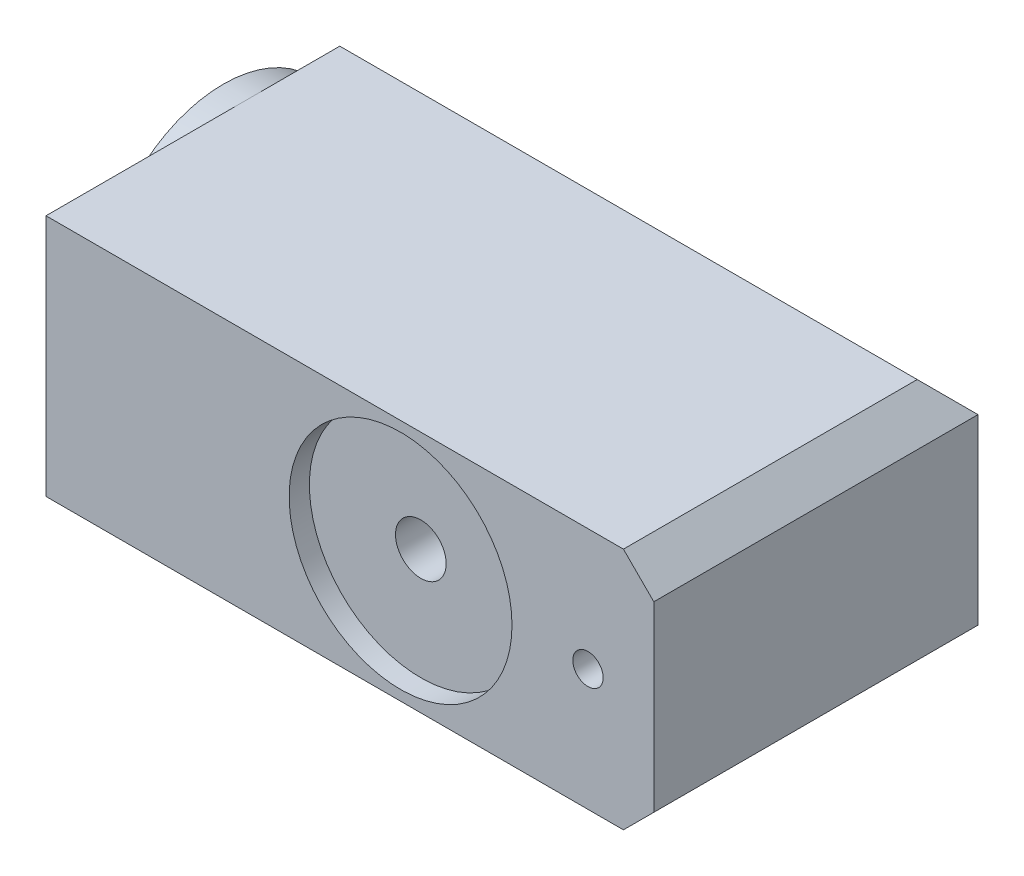
ISO-10303-21;
HEADER;
FILE_DESCRIPTION(('STEP AP214'),'2;1');
FILE_NAME('part.step','',(''),(''),'','','');
FILE_SCHEMA(('AUTOMOTIVE_DESIGN { 1 0 10303 214 1 1 1 1 }'));
ENDSEC;
DATA;
#1=APPLICATION_CONTEXT('core data for automotive mechanical design processes');
#2=APPLICATION_PROTOCOL_DEFINITION('international standard','automotive_design',2000,#1);
#3=PRODUCT_CONTEXT('',#1,'mechanical');
#4=PRODUCT('Part','Part','',(#3));
#5=PRODUCT_RELATED_PRODUCT_CATEGORY('part','',(#4));
#6=PRODUCT_DEFINITION_FORMATION('','',#4);
#7=PRODUCT_DEFINITION_CONTEXT('part definition',#1,'design');
#8=PRODUCT_DEFINITION('design','',#6,#7);
#9=PRODUCT_DEFINITION_SHAPE('','',#8);
#10=(LENGTH_UNIT() NAMED_UNIT(*) SI_UNIT(.MILLI.,.METRE.));
#11=(NAMED_UNIT(*) PLANE_ANGLE_UNIT() SI_UNIT($,.RADIAN.));
#12=(NAMED_UNIT(*) SI_UNIT($,.STERADIAN.) SOLID_ANGLE_UNIT());
#13=UNCERTAINTY_MEASURE_WITH_UNIT(LENGTH_MEASURE(1.E-05),#10,'distance_accuracy_value','');
#14=(GEOMETRIC_REPRESENTATION_CONTEXT(3) GLOBAL_UNCERTAINTY_ASSIGNED_CONTEXT((#13)) GLOBAL_UNIT_ASSIGNED_CONTEXT((#10,
#11,#12)) REPRESENTATION_CONTEXT('',''));
#15=CARTESIAN_POINT('',(0.,0.,0.));
#16=DIRECTION('',(0.,0.,1.));
#17=DIRECTION('',(1.,0.,0.));
#18=AXIS2_PLACEMENT_3D('',#15,#16,#17);
#19=CARTESIAN_POINT('',(-30.,12.,16.));
#20=DIRECTION('',(1.,0.,0.));
#21=DIRECTION('',(0.,1.,0.));
#22=AXIS2_PLACEMENT_3D('',#19,#20,#21);
#23=PLANE('',#22);
#24=DIRECTION('',(0.,0.,-1.));
#25=VECTOR('',#24,1.);
#26=CARTESIAN_POINT('',(-30.,12.,16.));
#27=LINE('',#26,#25);
#28=CARTESIAN_POINT('',(-30.,12.,-4.));
#29=VERTEX_POINT('',#28);
#30=CARTESIAN_POINT('',(-30.,12.,-13.));
#31=VERTEX_POINT('',#30);
#32=EDGE_CURVE('E218',#29,#31,#27,.T.);
#33=ORIENTED_EDGE('',*,*,#32,.T.);
#34=DIRECTION('',(0.,0.707106781186549,0.707106781186546));
#35=VECTOR('',#34,1.);
#36=CARTESIAN_POINT('',(-30.,12.,-13.));
#37=LINE('',#36,#35);
#38=CARTESIAN_POINT('',(-30.,8.99999999999998,-16.));
#39=VERTEX_POINT('',#38);
#40=EDGE_CURVE('E261',#31,#39,#37,.F.);
#41=ORIENTED_EDGE('',*,*,#40,.T.);
#42=DIRECTION('',(0.,-1.,0.));
#43=VECTOR('',#42,1.);
#44=CARTESIAN_POINT('',(-30.,12.,-16.));
#45=LINE('',#44,#43);
#46=CARTESIAN_POINT('',(-30.,0.,-16.));
#47=VERTEX_POINT('',#46);
#48=EDGE_CURVE('E197',#39,#47,#45,.T.);
#49=ORIENTED_EDGE('',*,*,#48,.T.);
#50=CARTESIAN_POINT('',(-30.,0.,-4.));
#51=DIRECTION('',(1.,0.,0.));
#52=DIRECTION('',(0.,1.,0.));
#53=AXIS2_PLACEMENT_3D('',#50,#51,#52);
#54=CIRCLE('',#53,12.);
#55=EDGE_CURVE('E182',#29,#47,#54,.F.);
#56=ORIENTED_EDGE('',*,*,#55,.F.);
#57=EDGE_LOOP('',(#33,#41,#49,#56));
#58=FACE_BOUND('',#57,.T.);
#59=ADVANCED_FACE('F51',(#58),#23,.F.);
#60=CARTESIAN_POINT('',(-30.,-8.99999999999998,-16.));
#61=VERTEX_POINT('',#60);
#62=EDGE_CURVE('E211',#47,#61,#45,.T.);
#63=ORIENTED_EDGE('',*,*,#62,.T.);
#64=DIRECTION('',(0.,0.707106781186549,-0.707106781186546));
#65=VECTOR('',#64,1.);
#66=CARTESIAN_POINT('',(-30.,-12.,-13.));
#67=LINE('',#66,#65);
#68=CARTESIAN_POINT('',(-30.,-12.,-13.));
#69=VERTEX_POINT('',#68);
#70=EDGE_CURVE('E254',#61,#69,#67,.F.);
#71=ORIENTED_EDGE('',*,*,#70,.T.);
#72=DIRECTION('',(0.,0.,-1.));
#73=VECTOR('',#72,1.);
#74=CARTESIAN_POINT('',(-30.,-12.,16.));
#75=LINE('',#74,#73);
#76=CARTESIAN_POINT('',(-30.,-12.,-4.));
#77=VERTEX_POINT('',#76);
#78=EDGE_CURVE('E207',#77,#69,#75,.T.);
#79=ORIENTED_EDGE('',*,*,#78,.F.);
#80=EDGE_CURVE('E177',#47,#77,#54,.F.);
#81=ORIENTED_EDGE('',*,*,#80,.F.);
#82=EDGE_LOOP('',(#63,#71,#79,#81));
#83=FACE_BOUND('',#82,.T.);
#84=ADVANCED_FACE('F290',(#83),#23,.F.);
#85=CARTESIAN_POINT('',(30.,12.,16.));
#86=DIRECTION('',(-1.,0.,0.));
#87=DIRECTION('',(0.,-1.,0.));
#88=AXIS2_PLACEMENT_3D('',#85,#86,#87);
#89=PLANE('',#88);
#90=DIRECTION('',(0.,1.,0.));
#91=VECTOR('',#90,1.);
#92=CARTESIAN_POINT('',(30.,12.,16.));
#93=LINE('',#92,#91);
#94=CARTESIAN_POINT('',(30.,-9.,16.));
#95=VERTEX_POINT('',#94);
#96=CARTESIAN_POINT('',(30.,8.99999999999998,16.));
#97=VERTEX_POINT('',#96);
#98=EDGE_CURVE('E192',#95,#97,#93,.T.);
#99=ORIENTED_EDGE('',*,*,#98,.F.);
#100=DIRECTION('',(0.,0.,-1.));
#101=VECTOR('',#100,1.);
#102=CARTESIAN_POINT('',(30.,-9.,16.));
#103=LINE('',#102,#101);
#104=CARTESIAN_POINT('',(30.,-9.,-16.));
#105=VERTEX_POINT('',#104);
#106=EDGE_CURVE('E225',#95,#105,#103,.T.);
#107=ORIENTED_EDGE('',*,*,#106,.T.);
#108=DIRECTION('',(0.,1.,0.));
#109=VECTOR('',#108,1.);
#110=CARTESIAN_POINT('',(30.,12.,-16.));
#111=LINE('',#110,#109);
#112=CARTESIAN_POINT('',(30.,8.99999999999998,-16.));
#113=VERTEX_POINT('',#112);
#114=EDGE_CURVE('E187',#105,#113,#111,.T.);
#115=ORIENTED_EDGE('',*,*,#114,.T.);
#116=DIRECTION('',(0.,0.,1.));
#117=VECTOR('',#116,1.);
#118=CARTESIAN_POINT('',(30.,8.99999999999998,16.));
#119=LINE('',#118,#117);
#120=EDGE_CURVE('E222',#113,#97,#119,.T.);
#121=ORIENTED_EDGE('',*,*,#120,.T.);
#122=EDGE_LOOP('',(#99,#107,#115,#121));
#123=FACE_BOUND('',#122,.T.);
#124=ADVANCED_FACE('F306',(#123),#89,.F.);
#125=CARTESIAN_POINT('',(-30.,12.,16.));
#126=DIRECTION('',(0.,-1.,0.));
#127=DIRECTION('',(0.,0.,-1.));
#128=AXIS2_PLACEMENT_3D('',#125,#126,#127);
#129=PLANE('',#128);
#130=DIRECTION('',(0.,0.,-1.));
#131=VECTOR('',#130,1.);
#132=CARTESIAN_POINT('',(27.,12.,16.));
#133=LINE('',#132,#131);
#134=CARTESIAN_POINT('',(27.,12.,16.));
#135=VERTEX_POINT('',#134);
#136=CARTESIAN_POINT('',(27.,12.,-13.));
#137=VERTEX_POINT('',#136);
#138=EDGE_CURVE('E238',#135,#137,#133,.T.);
#139=ORIENTED_EDGE('',*,*,#138,.T.);
#140=DIRECTION('',(-1.,0.,0.));
#141=VECTOR('',#140,1.);
#142=CARTESIAN_POINT('',(-30.,12.,-13.));
#143=LINE('',#142,#141);
#144=EDGE_CURVE('E257',#137,#31,#143,.T.);
#145=ORIENTED_EDGE('',*,*,#144,.T.);
#146=ORIENTED_EDGE('',*,*,#32,.F.);
#147=CARTESIAN_POINT('',(-30.,12.,16.));
#148=VERTEX_POINT('',#147);
#149=EDGE_CURVE('E219',#148,#29,#27,.T.);
#150=ORIENTED_EDGE('',*,*,#149,.F.);
#151=DIRECTION('',(-1.,0.,0.));
#152=VECTOR('',#151,1.);
#153=CARTESIAN_POINT('',(-30.,12.,16.));
#154=LINE('',#153,#152);
#155=EDGE_CURVE('E196',#135,#148,#154,.T.);
#156=ORIENTED_EDGE('',*,*,#155,.F.);
#157=EDGE_LOOP('',(#139,#145,#146,#150,#156));
#158=FACE_BOUND('',#157,.T.);
#159=ADVANCED_FACE('F333',(#158),#129,.F.);
#160=EDGE_CURVE('E181',#77,#29,#54,.F.);
#161=ORIENTED_EDGE('',*,*,#160,.F.);
#162=CARTESIAN_POINT('',(-30.,-12.,16.));
#163=VERTEX_POINT('',#162);
#164=EDGE_CURVE('E214',#163,#77,#75,.T.);
#165=ORIENTED_EDGE('',*,*,#164,.F.);
#166=DIRECTION('',(0.,-1.,0.));
#167=VECTOR('',#166,1.);
#168=CARTESIAN_POINT('',(-30.,12.,16.));
#169=LINE('',#168,#167);
#170=EDGE_CURVE('E200',#148,#163,#169,.T.);
#171=ORIENTED_EDGE('',*,*,#170,.F.);
#172=ORIENTED_EDGE('',*,*,#149,.T.);
#173=EDGE_LOOP('',(#161,#165,#171,#172));
#174=FACE_BOUND('',#173,.T.);
#175=ADVANCED_FACE('F284',(#174),#23,.F.);
#176=CARTESIAN_POINT('',(-30.,-12.,16.));
#177=DIRECTION('',(0.,1.,0.));
#178=DIRECTION('',(0.,0.,1.));
#179=AXIS2_PLACEMENT_3D('',#176,#177,#178);
#180=PLANE('',#179);
#181=ORIENTED_EDGE('',*,*,#78,.T.);
#182=DIRECTION('',(1.,0.,0.));
#183=VECTOR('',#182,1.);
#184=CARTESIAN_POINT('',(-30.,-12.,-13.));
#185=LINE('',#184,#183);
#186=CARTESIAN_POINT('',(27.,-12.,-13.));
#187=VERTEX_POINT('',#186);
#188=EDGE_CURVE('E241',#69,#187,#185,.T.);
#189=ORIENTED_EDGE('',*,*,#188,.T.);
#190=DIRECTION('',(0.,0.,1.));
#191=VECTOR('',#190,1.);
#192=CARTESIAN_POINT('',(27.,-12.,16.));
#193=LINE('',#192,#191);
#194=CARTESIAN_POINT('',(27.,-12.,16.));
#195=VERTEX_POINT('',#194);
#196=EDGE_CURVE('E229',#187,#195,#193,.T.);
#197=ORIENTED_EDGE('',*,*,#196,.T.);
#198=DIRECTION('',(1.,0.,0.));
#199=VECTOR('',#198,1.);
#200=CARTESIAN_POINT('',(-30.,-12.,16.));
#201=LINE('',#200,#199);
#202=EDGE_CURVE('E203',#163,#195,#201,.T.);
#203=ORIENTED_EDGE('',*,*,#202,.F.);
#204=ORIENTED_EDGE('',*,*,#164,.T.);
#205=EDGE_LOOP('',(#181,#189,#197,#203,#204));
#206=FACE_BOUND('',#205,.T.);
#207=ADVANCED_FACE('F295',(#206),#180,.F.);
#208=CARTESIAN_POINT('',(0.,0.,16.));
#209=DIRECTION('',(0.,0.,1.));
#210=DIRECTION('',(1.,0.,0.));
#211=AXIS2_PLACEMENT_3D('',#208,#209,#210);
#212=PLANE('',#211);
#213=CARTESIAN_POINT('',(23.5,0.,16.));
#214=DIRECTION('',(0.,0.,1.));
#215=DIRECTION('',(1.,0.,0.));
#216=AXIS2_PLACEMENT_3D('',#213,#214,#215);
#217=CIRCLE('',#216,1.5);
#218=CARTESIAN_POINT('',(25.,0.,16.));
#219=VERTEX_POINT('',#218);
#220=EDGE_CURVE('E151',#219,#219,#217,.T.);
#221=ORIENTED_EDGE('',*,*,#220,.F.);
#222=EDGE_LOOP('',(#221));
#223=FACE_BOUND('',#222,.T.);
#224=CARTESIAN_POINT('',(4.99999999999999,0.,16.));
#225=DIRECTION('',(0.,0.,1.));
#226=DIRECTION('',(1.,0.,0.));
#227=AXIS2_PLACEMENT_3D('',#224,#225,#226);
#228=CIRCLE('',#227,11.);
#229=CARTESIAN_POINT('',(16.,0.,16.));
#230=VERTEX_POINT('',#229);
#231=EDGE_CURVE('E188',#230,#230,#228,.T.);
#232=ORIENTED_EDGE('',*,*,#231,.F.);
#233=EDGE_LOOP('',(#232));
#234=FACE_BOUND('',#233,.T.);
#235=ORIENTED_EDGE('',*,*,#202,.T.);
#236=DIRECTION('',(-0.70710678118655,-0.707106781186545,0.));
#237=VECTOR('',#236,1.);
#238=CARTESIAN_POINT('',(19.4999999999999,-19.5,16.));
#239=LINE('',#238,#237);
#240=EDGE_CURVE('E235',#195,#95,#239,.F.);
#241=ORIENTED_EDGE('',*,*,#240,.T.);
#242=ORIENTED_EDGE('',*,*,#98,.T.);
#243=DIRECTION('',(0.707106781186546,-0.707106781186549,0.));
#244=VECTOR('',#243,1.);
#245=CARTESIAN_POINT('',(19.5000000000001,19.5,16.));
#246=LINE('',#245,#244);
#247=EDGE_CURVE('E232',#97,#135,#246,.F.);
#248=ORIENTED_EDGE('',*,*,#247,.T.);
#249=ORIENTED_EDGE('',*,*,#155,.T.);
#250=ORIENTED_EDGE('',*,*,#170,.T.);
#251=EDGE_LOOP('',(#235,#241,#242,#248,#249,#250));
#252=FACE_BOUND('',#251,.T.);
#253=ADVANCED_FACE('F299',(#223,#234,#252),#212,.T.);
#254=CARTESIAN_POINT('',(0.,0.,-16.));
#255=DIRECTION('',(0.,0.,1.));
#256=DIRECTION('',(1.,0.,0.));
#257=AXIS2_PLACEMENT_3D('',#254,#255,#256);
#258=PLANE('',#257);
#259=ORIENTED_EDGE('',*,*,#114,.F.);
#260=DIRECTION('',(-1.,0.,0.));
#261=VECTOR('',#260,1.);
#262=CARTESIAN_POINT('',(0.,-8.99999999999998,-16.));
#263=LINE('',#262,#261);
#264=EDGE_CURVE('E251',#105,#61,#263,.T.);
#265=ORIENTED_EDGE('',*,*,#264,.T.);
#266=ORIENTED_EDGE('',*,*,#62,.F.);
#267=ORIENTED_EDGE('',*,*,#48,.F.);
#268=DIRECTION('',(1.,0.,0.));
#269=VECTOR('',#268,1.);
#270=CARTESIAN_POINT('',(0.,8.99999999999998,-16.));
#271=LINE('',#270,#269);
#272=EDGE_CURVE('E248',#39,#113,#271,.T.);
#273=ORIENTED_EDGE('',*,*,#272,.T.);
#274=EDGE_LOOP('',(#259,#265,#266,#267,#273));
#275=FACE_BOUND('',#274,.T.);
#276=ADVANCED_FACE('F309',(#275),#258,.F.);
#277=CARTESIAN_POINT('',(30.,-9.,16.));
#278=DIRECTION('',(-0.707106781186545,0.70710678118655,0.));
#279=DIRECTION('',(0.,0.,-1.));
#280=AXIS2_PLACEMENT_3D('',#277,#278,#279);
#281=PLANE('',#280);
#282=ORIENTED_EDGE('',*,*,#196,.F.);
#283=DIRECTION('',(0.577350269189629,0.577350269189626,-0.577350269189623));
#284=VECTOR('',#283,1.);
#285=CARTESIAN_POINT('',(19.3333333333333,-19.6666666666666,-5.33333333333343));
#286=LINE('',#285,#284);
#287=EDGE_CURVE('E245',#187,#105,#286,.T.);
#288=ORIENTED_EDGE('',*,*,#287,.T.);
#289=ORIENTED_EDGE('',*,*,#106,.F.);
#290=ORIENTED_EDGE('',*,*,#240,.F.);
#291=EDGE_LOOP('',(#282,#288,#289,#290));
#292=FACE_BOUND('',#291,.T.);
#293=ADVANCED_FACE('F303',(#292),#281,.F.);
#294=CARTESIAN_POINT('',(27.,12.,16.));
#295=DIRECTION('',(-0.707106781186549,-0.707106781186546,0.));
#296=DIRECTION('',(0.,0.,-1.));
#297=AXIS2_PLACEMENT_3D('',#294,#295,#296);
#298=PLANE('',#297);
#299=ORIENTED_EDGE('',*,*,#120,.F.);
#300=DIRECTION('',(-0.577350269189625,0.577350269189628,0.577350269189625));
#301=VECTOR('',#300,1.);
#302=CARTESIAN_POINT('',(17.3333333333334,21.6666666666667,-3.33333333333336));
#303=LINE('',#302,#301);
#304=EDGE_CURVE('E81',#113,#137,#303,.T.);
#305=ORIENTED_EDGE('',*,*,#304,.T.);
#306=ORIENTED_EDGE('',*,*,#138,.F.);
#307=ORIENTED_EDGE('',*,*,#247,.F.);
#308=EDGE_LOOP('',(#299,#305,#306,#307));
#309=FACE_BOUND('',#308,.T.);
#310=ADVANCED_FACE('F349',(#309),#298,.F.);
#311=CARTESIAN_POINT('',(4.99999999999999,0.,14.));
#312=DIRECTION('',(0.,0.,1.));
#313=DIRECTION('',(1.,0.,0.));
#314=AXIS2_PLACEMENT_3D('',#311,#312,#313);
#315=CYLINDRICAL_SURFACE('',#314,11.);
#316=CARTESIAN_POINT('',(4.99999999999999,0.,14.));
#317=DIRECTION('',(0.,0.,1.));
#318=DIRECTION('',(1.,0.,0.));
#319=AXIS2_PLACEMENT_3D('',#316,#317,#318);
#320=CIRCLE('',#319,11.);
#321=CARTESIAN_POINT('',(16.,0.,14.));
#322=VERTEX_POINT('',#321);
#323=EDGE_CURVE('E183',#322,#322,#320,.T.);
#324=ORIENTED_EDGE('',*,*,#323,.F.);
#325=EDGE_LOOP('',(#324));
#326=FACE_BOUND('',#325,.T.);
#327=ORIENTED_EDGE('',*,*,#231,.T.);
#328=EDGE_LOOP('',(#327));
#329=FACE_BOUND('',#328,.T.);
#330=ADVANCED_FACE('F353',(#326,#329),#315,.F.);
#331=CARTESIAN_POINT('',(4.99999999999999,0.,14.));
#332=DIRECTION('',(0.,0.,1.));
#333=DIRECTION('',(1.,0.,0.));
#334=AXIS2_PLACEMENT_3D('',#331,#332,#333);
#335=PLANE('',#334);
#336=CARTESIAN_POINT('',(4.99999999999999,0.,14.));
#337=DIRECTION('',(0.,0.,1.));
#338=DIRECTION('',(1.,0.,0.));
#339=AXIS2_PLACEMENT_3D('',#336,#337,#338);
#340=CIRCLE('',#339,2.5);
#341=CARTESIAN_POINT('',(7.49999999999999,0.,14.));
#342=VERTEX_POINT('',#341);
#343=EDGE_CURVE('E569',#342,#342,#340,.T.);
#344=ORIENTED_EDGE('',*,*,#343,.F.);
#345=EDGE_LOOP('',(#344));
#346=FACE_BOUND('',#345,.T.);
#347=ORIENTED_EDGE('',*,*,#323,.T.);
#348=EDGE_LOOP('',(#347));
#349=FACE_BOUND('',#348,.T.);
#350=ADVANCED_FACE('F357',(#346,#349),#335,.T.);
#351=CARTESIAN_POINT('',(-32.5,0.,-4.));
#352=DIRECTION('',(1.,0.,0.));
#353=DIRECTION('',(0.,1.,0.));
#354=AXIS2_PLACEMENT_3D('',#351,#352,#353);
#355=CYLINDRICAL_SURFACE('',#354,9.5);
#356=CARTESIAN_POINT('',(7.49999999999999,0.,5.5));
#357=CARTESIAN_POINT('',(7.49999659165871,-0.137884663200167,5.4999978589319));
#358=CARTESIAN_POINT('',(7.48855441851343,-0.275806169982054,5.49696845553717));
#359=CARTESIAN_POINT('',(7.44316636127435,-0.547680422104071,5.48517762614523));
#360=CARTESIAN_POINT('',(7.40920923415977,-0.681631149673865,5.47641333641575));
#361=CARTESIAN_POINT('',(7.31996842460176,-0.941599795218325,5.45412076326044));
#362=CARTESIAN_POINT('',(7.26471183560934,-1.06762755548515,5.44059853395072));
#363=CARTESIAN_POINT('',(7.13453997893622,-1.30862652881559,5.41022151532826));
#364=CARTESIAN_POINT('',(7.0596235381961,-1.42359708156079,5.39336652717206));
#365=CARTESIAN_POINT('',(6.89046838430233,-1.64181993629425,5.35771941636593));
#366=CARTESIAN_POINT('',(6.79586767243448,-1.74478634632153,5.33889486727958));
#367=CARTESIAN_POINT('',(6.59080344133391,-1.93359084586557,5.30164002957558));
#368=CARTESIAN_POINT('',(6.48033793898573,-2.01942679084604,5.28320979057852));
#369=CARTESIAN_POINT('',(6.24441123162361,-2.17291708512181,5.24849966110085));
#370=CARTESIAN_POINT('',(6.11873074770613,-2.24024449868173,5.23226073792113));
#371=CARTESIAN_POINT('',(5.8573378957766,-2.35270147526437,5.20424780640168));
#372=CARTESIAN_POINT('',(5.72162732895978,-2.39783501276008,5.19247299871599));
#373=CARTESIAN_POINT('',(5.44718807189353,-2.46363395134783,5.17505594709916));
#374=CARTESIAN_POINT('',(5.30859185215417,-2.48481677617339,5.16928424369479));
#375=CARTESIAN_POINT('',(5.02970199432701,-2.50372582423423,5.16413995150101));
#376=CARTESIAN_POINT('',(4.88940866907858,-2.50145630672462,5.16476620075867));
#377=CARTESIAN_POINT('',(4.6151297705527,-2.47393631594874,5.1722310773399));
#378=CARTESIAN_POINT('',(4.48107626626276,-2.44930986906015,5.1789010040012));
#379=CARTESIAN_POINT('',(4.21907399632413,-2.37877367007175,5.19743185586801));
#380=CARTESIAN_POINT('',(4.09112570806025,-2.33286225663581,5.20929318626939));
#381=CARTESIAN_POINT('',(3.84332921291467,-2.22054589835919,5.23702010881477));
#382=CARTESIAN_POINT('',(3.72358589593431,-2.15392053169779,5.25292841794966));
#383=CARTESIAN_POINT('',(3.49675864085507,-2.0022213702002,5.28693362281546));
#384=CARTESIAN_POINT('',(3.38967714180209,-1.91714402987704,5.30503093886097));
#385=CARTESIAN_POINT('',(3.18764550754465,-1.72775627146102,5.3420790135668));
#386=CARTESIAN_POINT('',(3.09318807802019,-1.62292126601543,5.36103863220119));
#387=CARTESIAN_POINT('',(2.92309534560223,-1.39866809045069,5.39715951587145));
#388=CARTESIAN_POINT('',(2.84746074662742,-1.27924937519245,5.41432071363776));
#389=CARTESIAN_POINT('',(2.71695157003836,-1.02846858783735,5.44501219877018));
#390=CARTESIAN_POINT('',(2.66216418316355,-0.897059143717848,5.45852716922197));
#391=CARTESIAN_POINT('',(2.57559958620402,-0.626458525351712,5.48029259145042));
#392=CARTESIAN_POINT('',(2.54381748368608,-0.487269012444904,5.48854416252684));
#393=CARTESIAN_POINT('',(2.5049346793655,-0.209265832527545,5.49868456798611));
#394=CARTESIAN_POINT('',(2.49716387299718,-0.0705520479839298,5.50074610556024));
#395=CARTESIAN_POINT('',(2.50467639612566,0.206196087317413,5.49876969604928));
#396=CARTESIAN_POINT('',(2.51995740962853,0.344230504932652,5.49473236171185));
#397=CARTESIAN_POINT('',(2.57258954561613,0.613323515414332,5.48112321375656));
#398=CARTESIAN_POINT('',(2.60956867003488,0.744460020527066,5.47164474240174));
#399=CARTESIAN_POINT('',(2.70411687054361,0.998656954500423,5.44822690666909));
#400=CARTESIAN_POINT('',(2.76168814737889,1.12171651848974,5.43428706550801));
#401=CARTESIAN_POINT('',(2.89704132213315,1.35888360619122,5.40308612567744));
#402=CARTESIAN_POINT('',(2.97519008957206,1.47277384906795,5.38576639011377));
#403=CARTESIAN_POINT('',(3.14901703039048,1.68605972580164,5.34980860657983));
#404=CARTESIAN_POINT('',(3.24469857228237,1.78545256772039,5.33117030570127));
#405=CARTESIAN_POINT('',(3.4539990107019,1.96973268881778,5.29404354754289));
#406=CARTESIAN_POINT('',(3.56803766334183,2.05414772804201,5.27557319869389));
#407=CARTESIAN_POINT('',(3.80905049612895,2.20265077284399,5.24143699546797));
#408=CARTESIAN_POINT('',(3.93602412599753,2.26673964265903,5.2257710218657));
#409=CARTESIAN_POINT('',(4.19865623456443,2.37228864024204,5.1991961819113));
#410=CARTESIAN_POINT('',(4.33425868115595,2.41388084425638,5.18825962723044));
#411=CARTESIAN_POINT('',(4.61086822724661,2.47357685539613,5.17237100532096));
#412=CARTESIAN_POINT('',(4.75187398049022,2.49168647462762,5.16741745727661));
#413=CARTESIAN_POINT('',(5.03045917771289,2.5035754058712,5.16417710271858));
#414=CARTESIAN_POINT('',(5.16800434532391,2.49811278703346,5.16568256903698));
#415=CARTESIAN_POINT('',(5.44013800418689,2.46476570057896,5.17470557273123));
#416=CARTESIAN_POINT('',(5.57472656770531,2.43688178162009,5.18222296299294));
#417=CARTESIAN_POINT('',(5.83620045149247,2.35991776153104,5.20230081361892));
#418=CARTESIAN_POINT('',(5.9631349510855,2.31099432245761,5.21482395306799));
#419=CARTESIAN_POINT('',(6.20708916373461,2.19346205912632,5.2435040513402));
#420=CARTESIAN_POINT('',(6.32410735557114,2.12485022160876,5.25966156631347));
#421=CARTESIAN_POINT('',(6.5485354125825,1.96757430903026,5.29436941418334));
#422=CARTESIAN_POINT('',(6.65557291757329,1.87839103794925,5.31297513141964));
#423=CARTESIAN_POINT('',(6.85340941336071,1.68349652387403,5.35016921749174));
#424=CARTESIAN_POINT('',(6.94420447161772,1.57778128982408,5.36875758104519));
#425=CARTESIAN_POINT('',(7.10882024635571,1.35018708630134,5.40428175818212));
#426=CARTESIAN_POINT('',(7.18225135974022,1.22801920680847,5.42117547738053));
#427=CARTESIAN_POINT('',(7.30741745059362,0.972633879166114,5.45095016006557));
#428=CARTESIAN_POINT('',(7.35916670410621,0.839423771021185,5.46383376250233));
#429=CARTESIAN_POINT('',(7.43254809015212,0.588875796526845,5.48241870918101));
#430=CARTESIAN_POINT('',(7.4577847005347,0.472643351989966,5.4889642500444));
#431=CARTESIAN_POINT('',(7.49151134277624,0.237616231690475,5.49775561739774));
#432=CARTESIAN_POINT('',(7.50000293713037,0.118821796035813,5.50000184506058));
#433=CARTESIAN_POINT('',(7.49999999999999,0.,5.5));
#434=B_SPLINE_CURVE_WITH_KNOTS('',3,(#356,#357,#358,#359,#360,#361,#362,#363,#364,#365,#366,
#367,#368,#369,#370,#371,#372,#373,#374,#375,#376,#377,#378,#379,#380,#381,#382,#383,#384,#385,
#386,#387,#388,#389,#390,#391,#392,#393,#394,#395,#396,#397,#398,#399,#400,#401,#402,#403,#404,
#405,#406,#407,#408,#409,#410,#411,#412,#413,#414,#415,#416,#417,#418,#419,#420,#421,#422,#423,
#424,#425,#426,#427,#428,#429,#430,#431,#432,#433),.UNSPECIFIED.,.T.,.F.,(4,2,2,2,2,2,2,2,2,2,2,
2,2,2,2,2,2,2,2,2,2,2,2,2,2,2,2,2,2,2,2,2,2,2,2,2,2,2,4),(0.,0.413218307292529,
0.826643113984269,1.23954376015726,1.65246904879306,2.07379267437497,2.49516901176602,
2.92356960617624,3.35189345476611,3.77077570910304,4.18958189022737,4.59704611478664,
5.00454214813608,5.41653210536598,5.82860129537586,6.2537447574079,6.67890411617068,
7.10582259900531,7.53265026425716,7.94745325887929,8.36221458142332,8.7700647180204,
9.177958455819,9.59368485631318,10.0094912128133,10.4366941512347,10.8638789232118,
11.2885277256592,11.7130714044454,12.1240655288083,12.5350495962919,12.9430250337226,
13.3510629440972,13.7708169031548,14.1906723537905,14.6192052314105,15.0474555038948,
15.4035786755636,15.7596686154295),.UNSPECIFIED.);
#435=CARTESIAN_POINT('',(7.49999999999999,0.,5.5));
#436=VERTEX_POINT('',#435);
#437=EDGE_CURVE('E56',#436,#436,#434,.T.);
#438=ORIENTED_EDGE('',*,*,#437,.F.);
#439=EDGE_LOOP('',(#438));
#440=FACE_BOUND('',#439,.T.);
#441=CARTESIAN_POINT('',(23.,-1.4142135623731,5.39414711402797));
#442=CARTESIAN_POINT('',(22.960137340061,-1.40011970673381,5.39626758077751));
#443=CARTESIAN_POINT('',(22.9209013003721,-1.3843507187182,5.3986103359582));
#444=CARTESIAN_POINT('',(22.8439219717549,-1.34957291784789,5.40366775876576));
#445=CARTESIAN_POINT('',(22.8061785308876,-1.33056443580877,5.40638238841143));
#446=CARTESIAN_POINT('',(22.6956585352951,-1.26890986384077,5.41496619010077));
#447=CARTESIAN_POINT('',(22.6254564132959,-1.22158640772961,5.42128290951123));
#448=CARTESIAN_POINT('',(22.4940375072463,-1.1158688090482,5.43438740754582));
#449=CARTESIAN_POINT('',(22.4328228811174,-1.05747201542778,5.44117529872524));
#450=CARTESIAN_POINT('',(22.3210432752386,-0.93121668761424,5.45446222153537));
#451=CARTESIAN_POINT('',(22.270477019683,-0.863359288538879,5.46096128769718));
#452=CARTESIAN_POINT('',(22.1812895948509,-0.719835798307583,5.47296311582789));
#453=CARTESIAN_POINT('',(22.142704752577,-0.644146869647482,5.47846282729498));
#454=CARTESIAN_POINT('',(22.0788169734486,-0.487249825109341,5.48782150882409));
#455=CARTESIAN_POINT('',(22.0535148826397,-0.406041358035962,5.49168037436934));
#456=CARTESIAN_POINT('',(22.0171287920342,-0.241161892391548,5.49729349229693));
#457=CARTESIAN_POINT('',(22.0059243889218,-0.157518077510846,5.49906555881411));
#458=CARTESIAN_POINT('',(21.9976813646977,0.0104754969992231,5.50036544529815));
#459=CARTESIAN_POINT('',(22.0006412258737,0.0948251800274315,5.49989350571214));
#460=CARTESIAN_POINT('',(22.0205442831485,0.261074716115656,5.49677293127934));
#461=CARTESIAN_POINT('',(22.0373668621601,0.342989409274484,5.4941430729441));
#462=CARTESIAN_POINT('',(22.0843329626379,0.502816775045947,5.48702158836897));
#463=CARTESIAN_POINT('',(22.1144764075154,0.580729470665299,5.48252997283332));
#464=CARTESIAN_POINT('',(22.1873654413868,0.730736401333963,5.47215434081591));
#465=CARTESIAN_POINT('',(22.230165555,0.802803706598277,5.46626432214905));
#466=CARTESIAN_POINT('',(22.3271322317792,0.938806438536284,5.4537460929921));
#467=CARTESIAN_POINT('',(22.3813032870549,1.00273863534138,5.44711759125009));
#468=CARTESIAN_POINT('',(22.5001821199504,1.12138399514821,5.43377496415155));
#469=CARTESIAN_POINT('',(22.5650036117844,1.17598302232853,5.42706072863519));
#470=CARTESIAN_POINT('',(22.702903341002,1.27347686380495,5.41438683519921));
#471=CARTESIAN_POINT('',(22.77596836085,1.31639004816268,5.40842600093675));
#472=CARTESIAN_POINT('',(22.8761599122898,1.36438338605162,5.40152072453957));
#473=CARTESIAN_POINT('',(22.9005682404225,1.37528104906079,5.39993134003404));
#474=CARTESIAN_POINT('',(22.9499010853996,1.39574389449479,5.3969146924482));
#475=CARTESIAN_POINT('',(22.9748247138413,1.40531118102459,5.3954871740383));
#476=CARTESIAN_POINT('',(23.,1.4142135623731,5.39414711402797));
#477=B_SPLINE_CURVE_WITH_KNOTS('',3,(#441,#442,#443,#444,#445,#446,#447,#448,#449,#450,#451,
#452,#453,#454,#455,#456,#457,#458,#459,#460,#461,#462,#463,#464,#465,#466,#467,#468,#469,#470,
#471,#472,#473,#474,#475,#476),.UNSPECIFIED.,.F.,.F.,(4,2,2,2,2,2,2,2,2,2,2,2,2,2,2,2,2,4),(0.,
0.126921965744115,0.253830978035678,0.507221339028463,0.760672440572525,1.01409315826285,
1.26827489633055,1.5224728225564,1.7744846636609,2.02646950209578,2.2762847303728,
2.52609852234917,2.77700458563296,3.02800995695931,3.28189394943519,3.5353765034408,
3.61568266282445,3.69586033024587),.UNSPECIFIED.);
#478=CARTESIAN_POINT('',(23.,-1.4142135623731,5.39414711402797));
#479=VERTEX_POINT('',#478);
#480=CARTESIAN_POINT('',(23.,1.4142135623731,5.39414711402797));
#481=VERTEX_POINT('',#480);
#482=EDGE_CURVE('E150',#479,#481,#477,.T.);
#483=ORIENTED_EDGE('',*,*,#482,.F.);
#484=CARTESIAN_POINT('',(23.,0.,-4.));
#485=DIRECTION('',(-1.,0.,0.));
#486=DIRECTION('',(0.,-1.,0.));
#487=AXIS2_PLACEMENT_3D('',#484,#485,#486);
#488=CIRCLE('',#487,9.5);
#489=EDGE_CURVE('E156',#479,#481,#488,.F.);
#490=ORIENTED_EDGE('',*,*,#489,.T.);
#491=EDGE_LOOP('',(#483,#490));
#492=FACE_BOUND('',#491,.T.);
#493=CARTESIAN_POINT('',(-32.5,0.,-4.));
#494=DIRECTION('',(-1.,0.,0.));
#495=DIRECTION('',(0.,-1.,0.));
#496=AXIS2_PLACEMENT_3D('',#493,#494,#495);
#497=CIRCLE('',#496,9.5);
#498=CARTESIAN_POINT('',(-32.5,-9.50000000000001,-4.));
#499=VERTEX_POINT('',#498);
#500=EDGE_CURVE('E159',#499,#499,#497,.T.);
#501=ORIENTED_EDGE('',*,*,#500,.T.);
#502=EDGE_LOOP('',(#501));
#503=FACE_BOUND('',#502,.T.);
#504=ADVANCED_FACE('F366',(#440,#492,#503),#355,.F.);
#505=CARTESIAN_POINT('',(-32.5,0.,-4.));
#506=DIRECTION('',(1.,0.,0.));
#507=DIRECTION('',(0.,1.,0.));
#508=AXIS2_PLACEMENT_3D('',#505,#506,#507);
#509=CYLINDRICAL_SURFACE('',#508,12.);
#510=CARTESIAN_POINT('',(-32.5,0.,-4.));
#511=DIRECTION('',(-1.,0.,0.));
#512=DIRECTION('',(0.,-1.,0.));
#513=AXIS2_PLACEMENT_3D('',#510,#511,#512);
#514=CIRCLE('',#513,12.);
#515=CARTESIAN_POINT('',(-32.5,-12.,-4.));
#516=VERTEX_POINT('',#515);
#517=EDGE_CURVE('E164',#516,#516,#514,.T.);
#518=ORIENTED_EDGE('',*,*,#517,.F.);
#519=EDGE_LOOP('',(#518));
#520=FACE_BOUND('',#519,.T.);
#521=ORIENTED_EDGE('',*,*,#160,.T.);
#522=ORIENTED_EDGE('',*,*,#55,.T.);
#523=ORIENTED_EDGE('',*,*,#80,.T.);
#524=EDGE_LOOP('',(#521,#522,#523));
#525=FACE_BOUND('',#524,.T.);
#526=ADVANCED_FACE('F278',(#520,#525),#509,.T.);
#527=CARTESIAN_POINT('',(-32.5,0.,-4.));
#528=DIRECTION('',(-1.,0.,0.));
#529=DIRECTION('',(0.,-1.,0.));
#530=AXIS2_PLACEMENT_3D('',#527,#528,#529);
#531=PLANE('',#530);
#532=ORIENTED_EDGE('',*,*,#517,.T.);
#533=EDGE_LOOP('',(#532));
#534=FACE_BOUND('',#533,.T.);
#535=ORIENTED_EDGE('',*,*,#500,.F.);
#536=EDGE_LOOP('',(#535));
#537=FACE_BOUND('',#536,.T.);
#538=ADVANCED_FACE('F320',(#534,#537),#531,.T.);
#539=CARTESIAN_POINT('',(23.,12.,16.));
#540=DIRECTION('',(-1.,0.,0.));
#541=DIRECTION('',(0.,-1.,0.));
#542=AXIS2_PLACEMENT_3D('',#539,#540,#541);
#543=PLANE('',#542);
#544=DIRECTION('',(0.,0.,1.));
#545=VECTOR('',#544,1.);
#546=CARTESIAN_POINT('',(23.,-1.4142135623731,4.));
#547=LINE('',#546,#545);
#548=CARTESIAN_POINT('',(23.,-1.4142135623731,4.));
#549=VERTEX_POINT('',#548);
#550=EDGE_CURVE('E12',#549,#479,#547,.T.);
#551=ORIENTED_EDGE('',*,*,#550,.F.);
#552=DIRECTION('',(0.,1.,0.));
#553=VECTOR('',#552,1.);
#554=CARTESIAN_POINT('',(23.,12.,4.));
#555=LINE('',#554,#553);
#556=CARTESIAN_POINT('',(23.,1.4142135623731,4.));
#557=VERTEX_POINT('',#556);
#558=EDGE_CURVE('E138',#549,#557,#555,.T.);
#559=ORIENTED_EDGE('',*,*,#558,.T.);
#560=DIRECTION('',(0.,0.,1.));
#561=VECTOR('',#560,1.);
#562=CARTESIAN_POINT('',(23.,1.4142135623731,4.));
#563=LINE('',#562,#561);
#564=EDGE_CURVE('E67',#481,#557,#563,.F.);
#565=ORIENTED_EDGE('',*,*,#564,.F.);
#566=ORIENTED_EDGE('',*,*,#489,.F.);
#567=EDGE_LOOP('',(#551,#559,#565,#566));
#568=FACE_BOUND('',#567,.T.);
#569=ADVANCED_FACE('F154',(#568),#543,.T.);
#570=CARTESIAN_POINT('',(-30.,-12.,-13.));
#571=DIRECTION('',(0.,0.707106781186546,0.707106781186549));
#572=DIRECTION('',(1.,0.,0.));
#573=AXIS2_PLACEMENT_3D('',#570,#571,#572);
#574=PLANE('',#573);
#575=ORIENTED_EDGE('',*,*,#70,.F.);
#576=ORIENTED_EDGE('',*,*,#264,.F.);
#577=ORIENTED_EDGE('',*,*,#287,.F.);
#578=ORIENTED_EDGE('',*,*,#188,.F.);
#579=EDGE_LOOP('',(#575,#576,#577,#578));
#580=FACE_BOUND('',#579,.T.);
#581=ADVANCED_FACE('F313',(#580),#574,.F.);
#582=CARTESIAN_POINT('',(-30.,12.,-13.));
#583=DIRECTION('',(0.,-0.707106781186546,0.707106781186549));
#584=DIRECTION('',(-1.,0.,0.));
#585=AXIS2_PLACEMENT_3D('',#582,#583,#584);
#586=PLANE('',#585);
#587=ORIENTED_EDGE('',*,*,#304,.F.);
#588=ORIENTED_EDGE('',*,*,#272,.F.);
#589=ORIENTED_EDGE('',*,*,#40,.F.);
#590=ORIENTED_EDGE('',*,*,#144,.F.);
#591=EDGE_LOOP('',(#587,#588,#589,#590));
#592=FACE_BOUND('',#591,.T.);
#593=ADVANCED_FACE('F54',(#592),#586,.F.);
#594=CARTESIAN_POINT('',(23.5,0.,4.));
#595=DIRECTION('',(0.,0.,1.));
#596=DIRECTION('',(1.,0.,0.));
#597=AXIS2_PLACEMENT_3D('',#594,#595,#596);
#598=CYLINDRICAL_SURFACE('',#597,1.5);
#599=ORIENTED_EDGE('',*,*,#550,.T.);
#600=ORIENTED_EDGE('',*,*,#482,.T.);
#601=ORIENTED_EDGE('',*,*,#564,.T.);
#602=CARTESIAN_POINT('',(23.5,0.,4.));
#603=DIRECTION('',(0.,0.,1.));
#604=DIRECTION('',(1.,0.,0.));
#605=AXIS2_PLACEMENT_3D('',#602,#603,#604);
#606=CIRCLE('',#605,1.5);
#607=EDGE_CURVE('E73',#549,#557,#606,.T.);
#608=ORIENTED_EDGE('',*,*,#607,.F.);
#609=EDGE_LOOP('',(#599,#600,#601,#608));
#610=FACE_BOUND('',#609,.T.);
#611=ORIENTED_EDGE('',*,*,#220,.T.);
#612=EDGE_LOOP('',(#611));
#613=FACE_BOUND('',#612,.T.);
#614=ADVANCED_FACE('F146',(#610,#613),#598,.F.);
#615=CARTESIAN_POINT('',(23.5,0.,4.));
#616=DIRECTION('',(0.,0.,1.));
#617=DIRECTION('',(1.,0.,0.));
#618=AXIS2_PLACEMENT_3D('',#615,#616,#617);
#619=PLANE('',#618);
#620=ORIENTED_EDGE('',*,*,#607,.T.);
#621=ORIENTED_EDGE('',*,*,#558,.F.);
#622=EDGE_LOOP('',(#620,#621));
#623=FACE_BOUND('',#622,.T.);
#624=ADVANCED_FACE('F139',(#623),#619,.T.);
#625=CARTESIAN_POINT('',(4.99999999999999,0.,14.));
#626=DIRECTION('',(0.,0.,1.));
#627=DIRECTION('',(1.,0.,0.));
#628=AXIS2_PLACEMENT_3D('',#625,#626,#627);
#629=CYLINDRICAL_SURFACE('',#628,2.5);
#630=ORIENTED_EDGE('',*,*,#437,.T.);
#631=EDGE_LOOP('',(#630));
#632=FACE_BOUND('',#631,.T.);
#633=ORIENTED_EDGE('',*,*,#343,.T.);
#634=EDGE_LOOP('',(#633));
#635=FACE_BOUND('',#634,.T.);
#636=ADVANCED_FACE('F437',(#632,#635),#629,.F.);
#637=CLOSED_SHELL('',(#59,#84,#124,#159,#175,#207,#253,#276,#293,#310,#330,#350,#504,#526,#538,
#569,#581,#593,#614,#624,#636));
#638=MANIFOLD_SOLID_BREP('B2',#637);
#639=ADVANCED_BREP_SHAPE_REPRESENTATION('',(#18,#638),#14);
#640=SHAPE_DEFINITION_REPRESENTATION(#9,#639);
ENDSEC;
END-ISO-10303-21;
